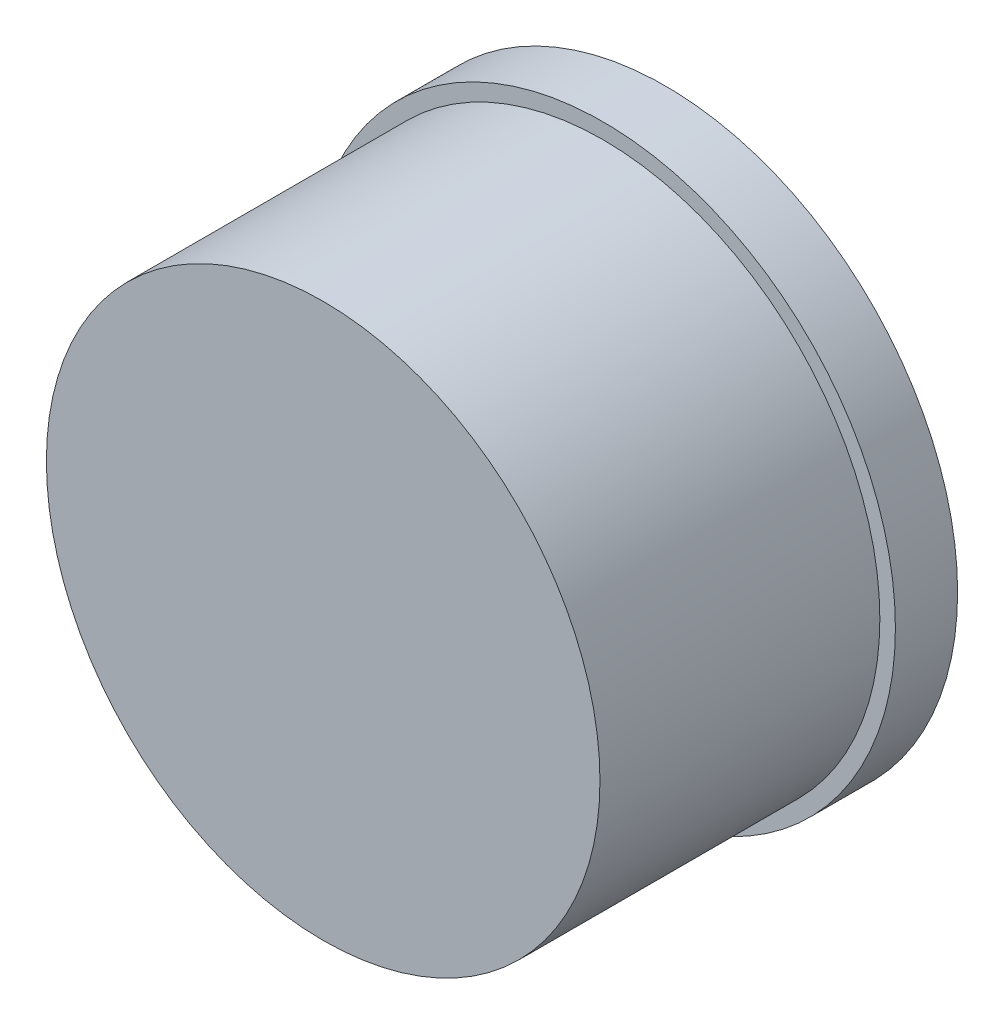
ISO-10303-21;
HEADER;
FILE_DESCRIPTION(('STEP AP214'),'2;1');
FILE_NAME('part.step','',(''),(''),'','','');
FILE_SCHEMA(('AUTOMOTIVE_DESIGN { 1 0 10303 214 1 1 1 1 }'));
ENDSEC;
DATA;
#1=APPLICATION_CONTEXT('core data for automotive mechanical design processes');
#2=APPLICATION_PROTOCOL_DEFINITION('international standard','automotive_design',2000,#1);
#3=PRODUCT_CONTEXT('',#1,'mechanical');
#4=PRODUCT('Part','Part','',(#3));
#5=PRODUCT_RELATED_PRODUCT_CATEGORY('part','',(#4));
#6=PRODUCT_DEFINITION_FORMATION('','',#4);
#7=PRODUCT_DEFINITION_CONTEXT('part definition',#1,'design');
#8=PRODUCT_DEFINITION('design','',#6,#7);
#9=PRODUCT_DEFINITION_SHAPE('','',#8);
#10=(LENGTH_UNIT() NAMED_UNIT(*) SI_UNIT(.MILLI.,.METRE.));
#11=(NAMED_UNIT(*) PLANE_ANGLE_UNIT() SI_UNIT($,.RADIAN.));
#12=(NAMED_UNIT(*) SI_UNIT($,.STERADIAN.) SOLID_ANGLE_UNIT());
#13=UNCERTAINTY_MEASURE_WITH_UNIT(LENGTH_MEASURE(1.E-05),#10,'distance_accuracy_value','');
#14=(GEOMETRIC_REPRESENTATION_CONTEXT(3) GLOBAL_UNCERTAINTY_ASSIGNED_CONTEXT((#13)) GLOBAL_UNIT_ASSIGNED_CONTEXT((#10,
#11,#12)) REPRESENTATION_CONTEXT('',''));
#15=CARTESIAN_POINT('',(0.,0.,0.));
#16=DIRECTION('',(0.,0.,1.));
#17=DIRECTION('',(1.,0.,0.));
#18=AXIS2_PLACEMENT_3D('',#15,#16,#17);
#19=CARTESIAN_POINT('',(-36.0769357225053,25.7883281275686,1.));
#20=DIRECTION('',(0.,0.,-1.));
#21=DIRECTION('',(-1.,0.,0.));
#22=AXIS2_PLACEMENT_3D('',#19,#20,#21);
#23=CYLINDRICAL_SURFACE('',#22,4.69999999999999);
#24=CARTESIAN_POINT('',(-36.0769357225053,25.7883281275686,1.));
#25=DIRECTION('',(0.,0.,1.));
#26=DIRECTION('',(1.,0.,0.));
#27=AXIS2_PLACEMENT_3D('',#24,#25,#26);
#28=CIRCLE('',#27,4.69999999999999);
#29=CARTESIAN_POINT('',(-31.3769357225053,25.7883281275686,1.));
#30=VERTEX_POINT('',#29);
#31=EDGE_CURVE('E41',#30,#30,#28,.T.);
#32=ORIENTED_EDGE('',*,*,#31,.F.);
#33=EDGE_LOOP('',(#32));
#34=FACE_BOUND('',#33,.T.);
#35=CARTESIAN_POINT('',(-36.0769357225053,25.7883281275686,0.));
#36=DIRECTION('',(0.,0.,1.));
#37=DIRECTION('',(1.,0.,0.));
#38=AXIS2_PLACEMENT_3D('',#35,#36,#37);
#39=CIRCLE('',#38,4.69999999999999);
#40=CARTESIAN_POINT('',(-31.3769357225053,25.7883281275686,0.));
#41=VERTEX_POINT('',#40);
#42=EDGE_CURVE('E37',#41,#41,#39,.T.);
#43=ORIENTED_EDGE('',*,*,#42,.T.);
#44=EDGE_LOOP('',(#43));
#45=FACE_BOUND('',#44,.T.);
#46=ADVANCED_FACE('F34',(#34,#45),#23,.T.);
#47=CARTESIAN_POINT('',(-36.0769357225053,25.7883281275686,1.));
#48=DIRECTION('',(0.,0.,1.));
#49=DIRECTION('',(1.,0.,0.));
#50=AXIS2_PLACEMENT_3D('',#47,#48,#49);
#51=PLANE('',#50);
#52=CARTESIAN_POINT('',(-36.0769357225053,25.7883281275686,1.));
#53=DIRECTION('',(0.,0.,1.));
#54=DIRECTION('',(1.,0.,0.));
#55=AXIS2_PLACEMENT_3D('',#52,#53,#54);
#56=CIRCLE('',#55,4.45);
#57=CARTESIAN_POINT('',(-31.6269357225053,25.7883281275686,1.));
#58=VERTEX_POINT('',#57);
#59=EDGE_CURVE('E10',#58,#58,#56,.T.);
#60=ORIENTED_EDGE('',*,*,#59,.F.);
#61=EDGE_LOOP('',(#60));
#62=FACE_BOUND('',#61,.T.);
#63=ORIENTED_EDGE('',*,*,#31,.T.);
#64=EDGE_LOOP('',(#63));
#65=FACE_BOUND('',#64,.T.);
#66=ADVANCED_FACE('F58',(#62,#65),#51,.T.);
#67=CARTESIAN_POINT('',(-36.0769357225053,25.7883281275686,0.));
#68=DIRECTION('',(0.,0.,1.));
#69=DIRECTION('',(1.,0.,0.));
#70=AXIS2_PLACEMENT_3D('',#67,#68,#69);
#71=PLANE('',#70);
#72=ORIENTED_EDGE('',*,*,#42,.F.);
#73=EDGE_LOOP('',(#72));
#74=FACE_BOUND('',#73,.T.);
#75=ADVANCED_FACE('F55',(#74),#71,.F.);
#76=CARTESIAN_POINT('',(-36.0769357225053,25.7883281275686,5.5));
#77=DIRECTION('',(0.,0.,-1.));
#78=DIRECTION('',(-1.,0.,0.));
#79=AXIS2_PLACEMENT_3D('',#76,#77,#78);
#80=CYLINDRICAL_SURFACE('',#79,4.45);
#81=CARTESIAN_POINT('',(-36.0769357225053,25.7883281275686,5.5));
#82=DIRECTION('',(0.,0.,1.));
#83=DIRECTION('',(1.,0.,0.));
#84=AXIS2_PLACEMENT_3D('',#81,#82,#83);
#85=CIRCLE('',#84,4.45);
#86=CARTESIAN_POINT('',(-31.6269357225053,25.7883281275686,5.5));
#87=VERTEX_POINT('',#86);
#88=EDGE_CURVE('E47',#87,#87,#85,.T.);
#89=ORIENTED_EDGE('',*,*,#88,.F.);
#90=EDGE_LOOP('',(#89));
#91=FACE_BOUND('',#90,.T.);
#92=ORIENTED_EDGE('',*,*,#59,.T.);
#93=EDGE_LOOP('',(#92));
#94=FACE_BOUND('',#93,.T.);
#95=ADVANCED_FACE('F57',(#91,#94),#80,.T.);
#96=CARTESIAN_POINT('',(-36.0769357225053,25.7883281275686,5.5));
#97=DIRECTION('',(0.,0.,1.));
#98=DIRECTION('',(1.,0.,0.));
#99=AXIS2_PLACEMENT_3D('',#96,#97,#98);
#100=PLANE('',#99);
#101=ORIENTED_EDGE('',*,*,#88,.T.);
#102=EDGE_LOOP('',(#101));
#103=FACE_BOUND('',#102,.T.);
#104=ADVANCED_FACE('F63',(#103),#100,.T.);
#105=CLOSED_SHELL('',(#46,#66,#75,#95,#104));
#106=MANIFOLD_SOLID_BREP('B2',#105);
#107=ADVANCED_BREP_SHAPE_REPRESENTATION('',(#18,#106),#14);
#108=SHAPE_DEFINITION_REPRESENTATION(#9,#107);
ENDSEC;
END-ISO-10303-21;
